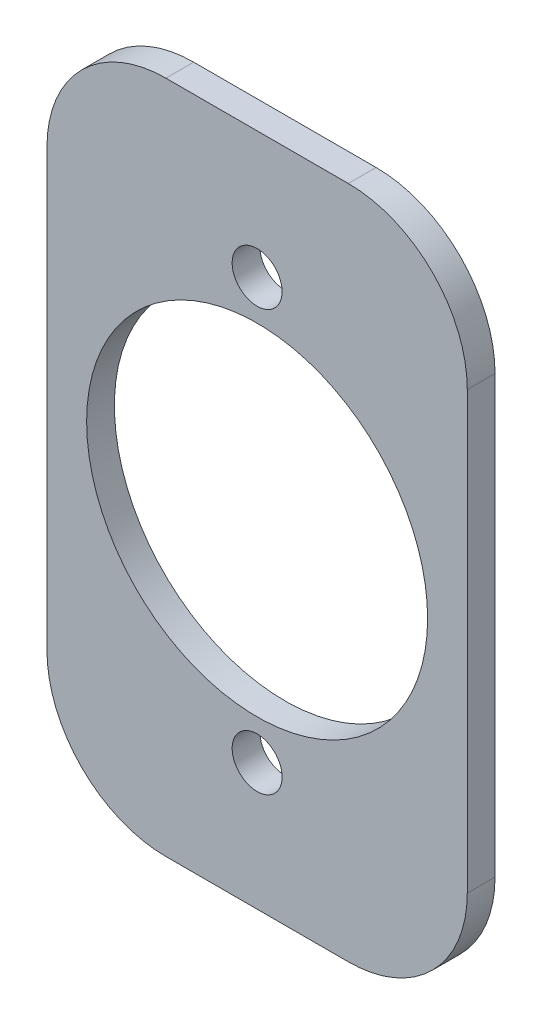
ISO-10303-21;
HEADER;
FILE_DESCRIPTION(('STEP AP214'),'2;1');
FILE_NAME('part.step','',(''),(''),'','','');
FILE_SCHEMA(('AUTOMOTIVE_DESIGN { 1 0 10303 214 1 1 1 1 }'));
ENDSEC;
DATA;
#1=APPLICATION_CONTEXT('core data for automotive mechanical design processes');
#2=APPLICATION_PROTOCOL_DEFINITION('international standard','automotive_design',2000,#1);
#3=PRODUCT_CONTEXT('',#1,'mechanical');
#4=PRODUCT('Part','Part','',(#3));
#5=PRODUCT_RELATED_PRODUCT_CATEGORY('part','',(#4));
#6=PRODUCT_DEFINITION_FORMATION('','',#4);
#7=PRODUCT_DEFINITION_CONTEXT('part definition',#1,'design');
#8=PRODUCT_DEFINITION('design','',#6,#7);
#9=PRODUCT_DEFINITION_SHAPE('','',#8);
#10=(LENGTH_UNIT() NAMED_UNIT(*) SI_UNIT(.MILLI.,.METRE.));
#11=(NAMED_UNIT(*) PLANE_ANGLE_UNIT() SI_UNIT($,.RADIAN.));
#12=(NAMED_UNIT(*) SI_UNIT($,.STERADIAN.) SOLID_ANGLE_UNIT());
#13=UNCERTAINTY_MEASURE_WITH_UNIT(LENGTH_MEASURE(1.E-05),#10,'distance_accuracy_value','');
#14=(GEOMETRIC_REPRESENTATION_CONTEXT(3) GLOBAL_UNCERTAINTY_ASSIGNED_CONTEXT((#13)) GLOBAL_UNIT_ASSIGNED_CONTEXT((#10,
#11,#12)) REPRESENTATION_CONTEXT('',''));
#15=CARTESIAN_POINT('',(0.,0.,0.));
#16=DIRECTION('',(0.,0.,1.));
#17=DIRECTION('',(1.,0.,0.));
#18=AXIS2_PLACEMENT_3D('',#15,#16,#17);
#19=CARTESIAN_POINT('',(-26.5,-42.5,-3.5));
#20=DIRECTION('',(1.,0.,0.));
#21=DIRECTION('',(0.,0.,-1.));
#22=AXIS2_PLACEMENT_3D('',#19,#20,#21);
#23=PLANE('',#22);
#24=DIRECTION('',(0.,0.,1.));
#25=VECTOR('',#24,1.);
#26=CARTESIAN_POINT('',(-26.5,-27.5,-3.5));
#27=LINE('',#26,#25);
#28=CARTESIAN_POINT('',(-26.5,-27.5,-3.5));
#29=VERTEX_POINT('',#28);
#30=CARTESIAN_POINT('',(-26.5,-27.5,0.));
#31=VERTEX_POINT('',#30);
#32=EDGE_CURVE('E143',#29,#31,#27,.T.);
#33=ORIENTED_EDGE('',*,*,#32,.T.);
#34=DIRECTION('',(0.,1.,0.));
#35=VECTOR('',#34,1.);
#36=CARTESIAN_POINT('',(-26.5,-42.5,0.));
#37=LINE('',#36,#35);
#38=CARTESIAN_POINT('',(-26.5,27.5,0.));
#39=VERTEX_POINT('',#38);
#40=EDGE_CURVE('E112',#31,#39,#37,.T.);
#41=ORIENTED_EDGE('',*,*,#40,.T.);
#42=DIRECTION('',(0.,0.,1.));
#43=VECTOR('',#42,1.);
#44=CARTESIAN_POINT('',(-26.5,27.5,-3.5));
#45=LINE('',#44,#43);
#46=CARTESIAN_POINT('',(-26.5,27.5,-3.5));
#47=VERTEX_POINT('',#46);
#48=EDGE_CURVE('E146',#39,#47,#45,.F.);
#49=ORIENTED_EDGE('',*,*,#48,.T.);
#50=DIRECTION('',(0.,1.,0.));
#51=VECTOR('',#50,1.);
#52=CARTESIAN_POINT('',(-26.5,-42.5,-3.5));
#53=LINE('',#52,#51);
#54=EDGE_CURVE('E155',#29,#47,#53,.T.);
#55=ORIENTED_EDGE('',*,*,#54,.F.);
#56=EDGE_LOOP('',(#33,#41,#49,#55));
#57=FACE_BOUND('',#56,.T.);
#58=ADVANCED_FACE('F39',(#57),#23,.F.);
#59=CARTESIAN_POINT('',(26.5,42.5,-3.5));
#60=DIRECTION('',(0.,-1.,0.));
#61=DIRECTION('',(0.,0.,-1.));
#62=AXIS2_PLACEMENT_3D('',#59,#60,#61);
#63=PLANE('',#62);
#64=DIRECTION('',(0.,0.,1.));
#65=VECTOR('',#64,1.);
#66=CARTESIAN_POINT('',(-11.5,42.5,-3.5));
#67=LINE('',#66,#65);
#68=CARTESIAN_POINT('',(-11.5,42.5,-3.5));
#69=VERTEX_POINT('',#68);
#70=CARTESIAN_POINT('',(-11.5,42.5,0.));
#71=VERTEX_POINT('',#70);
#72=EDGE_CURVE('E120',#69,#71,#67,.T.);
#73=ORIENTED_EDGE('',*,*,#72,.T.);
#74=DIRECTION('',(-1.,0.,0.));
#75=VECTOR('',#74,1.);
#76=CARTESIAN_POINT('',(-26.5,42.5,0.));
#77=LINE('',#76,#75);
#78=CARTESIAN_POINT('',(11.5,42.5,0.));
#79=VERTEX_POINT('',#78);
#80=EDGE_CURVE('E53',#79,#71,#77,.T.);
#81=ORIENTED_EDGE('',*,*,#80,.F.);
#82=DIRECTION('',(0.,0.,1.));
#83=VECTOR('',#82,1.);
#84=CARTESIAN_POINT('',(11.5,42.5,-3.5));
#85=LINE('',#84,#83);
#86=CARTESIAN_POINT('',(11.5,42.5,-3.5));
#87=VERTEX_POINT('',#86);
#88=EDGE_CURVE('E47',#79,#87,#85,.F.);
#89=ORIENTED_EDGE('',*,*,#88,.T.);
#90=DIRECTION('',(1.,0.,0.));
#91=VECTOR('',#90,1.);
#92=CARTESIAN_POINT('',(26.5,42.5,-3.5));
#93=LINE('',#92,#91);
#94=EDGE_CURVE('E153',#69,#87,#93,.T.);
#95=ORIENTED_EDGE('',*,*,#94,.F.);
#96=EDGE_LOOP('',(#73,#81,#89,#95));
#97=FACE_BOUND('',#96,.T.);
#98=ADVANCED_FACE('F116',(#97),#63,.F.);
#99=CARTESIAN_POINT('',(26.5,-42.5,-3.5));
#100=DIRECTION('',(-1.,0.,0.));
#101=DIRECTION('',(0.,0.,1.));
#102=AXIS2_PLACEMENT_3D('',#99,#100,#101);
#103=PLANE('',#102);
#104=DIRECTION('',(0.,0.,1.));
#105=VECTOR('',#104,1.);
#106=CARTESIAN_POINT('',(26.5,27.5,-3.5));
#107=LINE('',#106,#105);
#108=CARTESIAN_POINT('',(26.5,27.5,-3.5));
#109=VERTEX_POINT('',#108);
#110=CARTESIAN_POINT('',(26.5,27.5,0.));
#111=VERTEX_POINT('',#110);
#112=EDGE_CURVE('E129',#109,#111,#107,.T.);
#113=ORIENTED_EDGE('',*,*,#112,.T.);
#114=DIRECTION('',(0.,1.,0.));
#115=VECTOR('',#114,1.);
#116=CARTESIAN_POINT('',(26.5,-42.5,0.));
#117=LINE('',#116,#115);
#118=CARTESIAN_POINT('',(26.5,-27.5,0.));
#119=VERTEX_POINT('',#118);
#120=EDGE_CURVE('E106',#119,#111,#117,.T.);
#121=ORIENTED_EDGE('',*,*,#120,.F.);
#122=DIRECTION('',(0.,0.,1.));
#123=VECTOR('',#122,1.);
#124=CARTESIAN_POINT('',(26.5,-27.5,-3.5));
#125=LINE('',#124,#123);
#126=CARTESIAN_POINT('',(26.5,-27.5,-3.5));
#127=VERTEX_POINT('',#126);
#128=EDGE_CURVE('E61',#119,#127,#125,.F.);
#129=ORIENTED_EDGE('',*,*,#128,.T.);
#130=DIRECTION('',(0.,-1.,0.));
#131=VECTOR('',#130,1.);
#132=CARTESIAN_POINT('',(26.5,-42.5,-3.5));
#133=LINE('',#132,#131);
#134=EDGE_CURVE('E151',#109,#127,#133,.T.);
#135=ORIENTED_EDGE('',*,*,#134,.F.);
#136=EDGE_LOOP('',(#113,#121,#129,#135));
#137=FACE_BOUND('',#136,.T.);
#138=ADVANCED_FACE('F202',(#137),#103,.F.);
#139=CARTESIAN_POINT('',(26.5,-42.5,-3.5));
#140=DIRECTION('',(0.,1.,0.));
#141=DIRECTION('',(0.,0.,1.));
#142=AXIS2_PLACEMENT_3D('',#139,#140,#141);
#143=PLANE('',#142);
#144=DIRECTION('',(0.,0.,1.));
#145=VECTOR('',#144,1.);
#146=CARTESIAN_POINT('',(11.5,-42.5,-3.5));
#147=LINE('',#146,#145);
#148=CARTESIAN_POINT('',(11.5,-42.5,-3.5));
#149=VERTEX_POINT('',#148);
#150=CARTESIAN_POINT('',(11.5,-42.5,0.));
#151=VERTEX_POINT('',#150);
#152=EDGE_CURVE('E140',#149,#151,#147,.T.);
#153=ORIENTED_EDGE('',*,*,#152,.T.);
#154=DIRECTION('',(-1.,0.,0.));
#155=VECTOR('',#154,1.);
#156=CARTESIAN_POINT('',(-26.5,-42.5,0.));
#157=LINE('',#156,#155);
#158=CARTESIAN_POINT('',(-11.5,-42.5,0.));
#159=VERTEX_POINT('',#158);
#160=EDGE_CURVE('E121',#151,#159,#157,.T.);
#161=ORIENTED_EDGE('',*,*,#160,.T.);
#162=DIRECTION('',(0.,0.,1.));
#163=VECTOR('',#162,1.);
#164=CARTESIAN_POINT('',(-11.5,-42.5,-3.5));
#165=LINE('',#164,#163);
#166=CARTESIAN_POINT('',(-11.5,-42.5,-3.5));
#167=VERTEX_POINT('',#166);
#168=EDGE_CURVE('E138',#159,#167,#165,.F.);
#169=ORIENTED_EDGE('',*,*,#168,.T.);
#170=DIRECTION('',(-1.,0.,0.));
#171=VECTOR('',#170,1.);
#172=CARTESIAN_POINT('',(26.5,-42.5,-3.5));
#173=LINE('',#172,#171);
#174=EDGE_CURVE('E148',#149,#167,#173,.T.);
#175=ORIENTED_EDGE('',*,*,#174,.F.);
#176=EDGE_LOOP('',(#153,#161,#169,#175));
#177=FACE_BOUND('',#176,.T.);
#178=ADVANCED_FACE('F185',(#177),#143,.F.);
#179=CARTESIAN_POINT('',(0.,0.,-3.5));
#180=DIRECTION('',(0.,0.,1.));
#181=DIRECTION('',(1.,0.,0.));
#182=AXIS2_PLACEMENT_3D('',#179,#180,#181);
#183=PLANE('',#182);
#184=CARTESIAN_POINT('',(0.,26.5,-3.5));
#185=DIRECTION('',(0.,0.,1.));
#186=DIRECTION('',(1.,0.,0.));
#187=AXIS2_PLACEMENT_3D('',#184,#185,#186);
#188=CIRCLE('',#187,3.15);
#189=CARTESIAN_POINT('',(3.14999999999999,26.5,-3.5));
#190=VERTEX_POINT('',#189);
#191=EDGE_CURVE('E161',#190,#190,#188,.T.);
#192=ORIENTED_EDGE('',*,*,#191,.T.);
#193=EDGE_LOOP('',(#192));
#194=FACE_BOUND('',#193,.T.);
#195=CARTESIAN_POINT('',(0.,-26.5,-3.5));
#196=DIRECTION('',(0.,0.,1.));
#197=DIRECTION('',(1.,0.,0.));
#198=AXIS2_PLACEMENT_3D('',#195,#196,#197);
#199=CIRCLE('',#198,3.15);
#200=CARTESIAN_POINT('',(3.15000000000001,-26.5,-3.5));
#201=VERTEX_POINT('',#200);
#202=EDGE_CURVE('E162',#201,#201,#199,.T.);
#203=ORIENTED_EDGE('',*,*,#202,.T.);
#204=EDGE_LOOP('',(#203));
#205=FACE_BOUND('',#204,.T.);
#206=CARTESIAN_POINT('',(0.,0.,-3.5));
#207=DIRECTION('',(0.,0.,1.));
#208=DIRECTION('',(1.,0.,0.));
#209=AXIS2_PLACEMENT_3D('',#206,#207,#208);
#210=CIRCLE('',#209,21.5);
#211=CARTESIAN_POINT('',(21.5,0.,-3.5));
#212=VERTEX_POINT('',#211);
#213=EDGE_CURVE('E158',#212,#212,#210,.T.);
#214=ORIENTED_EDGE('',*,*,#213,.T.);
#215=EDGE_LOOP('',(#214));
#216=FACE_BOUND('',#215,.T.);
#217=ORIENTED_EDGE('',*,*,#174,.T.);
#218=CARTESIAN_POINT('',(-11.5,-27.5,-3.5));
#219=DIRECTION('',(0.,0.,1.));
#220=DIRECTION('',(1.,0.,0.));
#221=AXIS2_PLACEMENT_3D('',#218,#219,#220);
#222=CIRCLE('',#221,15.);
#223=EDGE_CURVE('E131',#167,#29,#222,.F.);
#224=ORIENTED_EDGE('',*,*,#223,.T.);
#225=ORIENTED_EDGE('',*,*,#54,.T.);
#226=CARTESIAN_POINT('',(-11.5,27.5,-3.5));
#227=DIRECTION('',(0.,0.,1.));
#228=DIRECTION('',(1.,0.,0.));
#229=AXIS2_PLACEMENT_3D('',#226,#227,#228);
#230=CIRCLE('',#229,15.);
#231=EDGE_CURVE('E136',#47,#69,#230,.F.);
#232=ORIENTED_EDGE('',*,*,#231,.T.);
#233=ORIENTED_EDGE('',*,*,#94,.T.);
#234=CARTESIAN_POINT('',(11.5,27.5,-3.5));
#235=DIRECTION('',(0.,0.,1.));
#236=DIRECTION('',(1.,0.,0.));
#237=AXIS2_PLACEMENT_3D('',#234,#235,#236);
#238=CIRCLE('',#237,15.);
#239=EDGE_CURVE('E125',#87,#109,#238,.F.);
#240=ORIENTED_EDGE('',*,*,#239,.T.);
#241=ORIENTED_EDGE('',*,*,#134,.T.);
#242=CARTESIAN_POINT('',(11.5,-27.5,-3.5));
#243=DIRECTION('',(0.,0.,1.));
#244=DIRECTION('',(1.,0.,0.));
#245=AXIS2_PLACEMENT_3D('',#242,#243,#244);
#246=CIRCLE('',#245,15.);
#247=EDGE_CURVE('E133',#127,#149,#246,.F.);
#248=ORIENTED_EDGE('',*,*,#247,.T.);
#249=EDGE_LOOP('',(#217,#224,#225,#232,#233,#240,#241,#248));
#250=FACE_BOUND('',#249,.T.);
#251=ADVANCED_FACE('F196',(#194,#205,#216,#250),#183,.F.);
#252=CARTESIAN_POINT('',(0.,0.,-3.5));
#253=DIRECTION('',(0.,0.,1.));
#254=DIRECTION('',(1.,0.,0.));
#255=AXIS2_PLACEMENT_3D('',#252,#253,#254);
#256=CYLINDRICAL_SURFACE('',#255,21.5);
#257=CARTESIAN_POINT('',(0.,0.,0.));
#258=DIRECTION('',(0.,0.,-1.));
#259=DIRECTION('',(-1.,0.,0.));
#260=AXIS2_PLACEMENT_3D('',#257,#258,#259);
#261=CIRCLE('',#260,21.5);
#262=CARTESIAN_POINT('',(-21.5,0.,0.));
#263=VERTEX_POINT('',#262);
#264=EDGE_CURVE('E165',#263,#263,#261,.F.);
#265=ORIENTED_EDGE('',*,*,#264,.T.);
#266=EDGE_LOOP('',(#265));
#267=FACE_BOUND('',#266,.T.);
#268=ORIENTED_EDGE('',*,*,#213,.F.);
#269=EDGE_LOOP('',(#268));
#270=FACE_BOUND('',#269,.T.);
#271=ADVANCED_FACE('F226',(#267,#270),#256,.F.);
#272=CARTESIAN_POINT('',(0.,-26.5,-3.5));
#273=DIRECTION('',(0.,0.,1.));
#274=DIRECTION('',(1.,0.,0.));
#275=AXIS2_PLACEMENT_3D('',#272,#273,#274);
#276=CYLINDRICAL_SURFACE('',#275,3.15);
#277=CARTESIAN_POINT('',(0.,-26.5,0.));
#278=DIRECTION('',(0.,0.,-1.));
#279=DIRECTION('',(-1.,0.,0.));
#280=AXIS2_PLACEMENT_3D('',#277,#278,#279);
#281=CIRCLE('',#280,3.15);
#282=CARTESIAN_POINT('',(-3.14999999999999,-26.5,0.));
#283=VERTEX_POINT('',#282);
#284=EDGE_CURVE('E170',#283,#283,#281,.F.);
#285=ORIENTED_EDGE('',*,*,#284,.T.);
#286=EDGE_LOOP('',(#285));
#287=FACE_BOUND('',#286,.T.);
#288=ORIENTED_EDGE('',*,*,#202,.F.);
#289=EDGE_LOOP('',(#288));
#290=FACE_BOUND('',#289,.T.);
#291=ADVANCED_FACE('F230',(#287,#290),#276,.F.);
#292=CARTESIAN_POINT('',(0.,26.5,-3.5));
#293=DIRECTION('',(0.,0.,1.));
#294=DIRECTION('',(1.,0.,0.));
#295=AXIS2_PLACEMENT_3D('',#292,#293,#294);
#296=CYLINDRICAL_SURFACE('',#295,3.15);
#297=CARTESIAN_POINT('',(0.,26.5,0.));
#298=DIRECTION('',(0.,0.,-1.));
#299=DIRECTION('',(-1.,0.,0.));
#300=AXIS2_PLACEMENT_3D('',#297,#298,#299);
#301=CIRCLE('',#300,3.15);
#302=CARTESIAN_POINT('',(-3.15000000000001,26.5,0.));
#303=VERTEX_POINT('',#302);
#304=EDGE_CURVE('E173',#303,#303,#301,.F.);
#305=ORIENTED_EDGE('',*,*,#304,.T.);
#306=EDGE_LOOP('',(#305));
#307=FACE_BOUND('',#306,.T.);
#308=ORIENTED_EDGE('',*,*,#191,.F.);
#309=EDGE_LOOP('',(#308));
#310=FACE_BOUND('',#309,.T.);
#311=ADVANCED_FACE('F211',(#307,#310),#296,.F.);
#312=CARTESIAN_POINT('',(-11.5,-27.5,-3.5));
#313=DIRECTION('',(0.,0.,1.));
#314=DIRECTION('',(1.,0.,0.));
#315=AXIS2_PLACEMENT_3D('',#312,#313,#314);
#316=CYLINDRICAL_SURFACE('',#315,15.);
#317=CARTESIAN_POINT('',(-11.5,-27.5,0.));
#318=DIRECTION('',(0.,0.,-1.));
#319=DIRECTION('',(-1.,0.,0.));
#320=AXIS2_PLACEMENT_3D('',#317,#318,#319);
#321=CIRCLE('',#320,15.);
#322=EDGE_CURVE('E176',#31,#159,#321,.F.);
#323=ORIENTED_EDGE('',*,*,#322,.F.);
#324=ORIENTED_EDGE('',*,*,#32,.F.);
#325=ORIENTED_EDGE('',*,*,#223,.F.);
#326=ORIENTED_EDGE('',*,*,#168,.F.);
#327=EDGE_LOOP('',(#323,#324,#325,#326));
#328=FACE_BOUND('',#327,.T.);
#329=ADVANCED_FACE('F192',(#328),#316,.T.);
#330=CARTESIAN_POINT('',(11.5,-27.5,-3.5));
#331=DIRECTION('',(0.,0.,1.));
#332=DIRECTION('',(1.,0.,0.));
#333=AXIS2_PLACEMENT_3D('',#330,#331,#332);
#334=CYLINDRICAL_SURFACE('',#333,15.);
#335=CARTESIAN_POINT('',(11.5,-27.5,0.));
#336=DIRECTION('',(0.,0.,-1.));
#337=DIRECTION('',(-1.,0.,0.));
#338=AXIS2_PLACEMENT_3D('',#335,#336,#337);
#339=CIRCLE('',#338,15.);
#340=EDGE_CURVE('E111',#151,#119,#339,.F.);
#341=ORIENTED_EDGE('',*,*,#340,.F.);
#342=ORIENTED_EDGE('',*,*,#152,.F.);
#343=ORIENTED_EDGE('',*,*,#247,.F.);
#344=ORIENTED_EDGE('',*,*,#128,.F.);
#345=EDGE_LOOP('',(#341,#342,#343,#344));
#346=FACE_BOUND('',#345,.T.);
#347=ADVANCED_FACE('F204',(#346),#334,.T.);
#348=CARTESIAN_POINT('',(11.5,27.5,-3.5));
#349=DIRECTION('',(0.,0.,1.));
#350=DIRECTION('',(1.,0.,0.));
#351=AXIS2_PLACEMENT_3D('',#348,#349,#350);
#352=CYLINDRICAL_SURFACE('',#351,15.);
#353=CARTESIAN_POINT('',(11.5,27.5,0.));
#354=DIRECTION('',(0.,0.,-1.));
#355=DIRECTION('',(-1.,0.,0.));
#356=AXIS2_PLACEMENT_3D('',#353,#354,#355);
#357=CIRCLE('',#356,15.);
#358=EDGE_CURVE('E103',#111,#79,#357,.F.);
#359=ORIENTED_EDGE('',*,*,#358,.F.);
#360=ORIENTED_EDGE('',*,*,#112,.F.);
#361=ORIENTED_EDGE('',*,*,#239,.F.);
#362=ORIENTED_EDGE('',*,*,#88,.F.);
#363=EDGE_LOOP('',(#359,#360,#361,#362));
#364=FACE_BOUND('',#363,.T.);
#365=ADVANCED_FACE('F124',(#364),#352,.T.);
#366=CARTESIAN_POINT('',(-11.5,27.5,-3.5));
#367=DIRECTION('',(0.,0.,1.));
#368=DIRECTION('',(1.,0.,0.));
#369=AXIS2_PLACEMENT_3D('',#366,#367,#368);
#370=CYLINDRICAL_SURFACE('',#369,15.);
#371=CARTESIAN_POINT('',(-11.5,27.5,0.));
#372=DIRECTION('',(0.,0.,-1.));
#373=DIRECTION('',(-1.,0.,0.));
#374=AXIS2_PLACEMENT_3D('',#371,#372,#373);
#375=CIRCLE('',#374,15.);
#376=EDGE_CURVE('E11',#71,#39,#375,.F.);
#377=ORIENTED_EDGE('',*,*,#376,.F.);
#378=ORIENTED_EDGE('',*,*,#72,.F.);
#379=ORIENTED_EDGE('',*,*,#231,.F.);
#380=ORIENTED_EDGE('',*,*,#48,.F.);
#381=EDGE_LOOP('',(#377,#378,#379,#380));
#382=FACE_BOUND('',#381,.T.);
#383=ADVANCED_FACE('F41',(#382),#370,.T.);
#384=CARTESIAN_POINT('',(-26.5,-42.5,0.));
#385=DIRECTION('',(0.,0.,-1.));
#386=DIRECTION('',(-1.,0.,0.));
#387=AXIS2_PLACEMENT_3D('',#384,#385,#386);
#388=PLANE('',#387);
#389=ORIENTED_EDGE('',*,*,#284,.F.);
#390=EDGE_LOOP('',(#389));
#391=FACE_BOUND('',#390,.T.);
#392=ORIENTED_EDGE('',*,*,#322,.T.);
#393=ORIENTED_EDGE('',*,*,#160,.F.);
#394=ORIENTED_EDGE('',*,*,#340,.T.);
#395=ORIENTED_EDGE('',*,*,#120,.T.);
#396=ORIENTED_EDGE('',*,*,#358,.T.);
#397=ORIENTED_EDGE('',*,*,#80,.T.);
#398=ORIENTED_EDGE('',*,*,#376,.T.);
#399=ORIENTED_EDGE('',*,*,#40,.F.);
#400=EDGE_LOOP('',(#392,#393,#394,#395,#396,#397,#398,#399));
#401=FACE_BOUND('',#400,.T.);
#402=ORIENTED_EDGE('',*,*,#304,.F.);
#403=EDGE_LOOP('',(#402));
#404=FACE_BOUND('',#403,.T.);
#405=ORIENTED_EDGE('',*,*,#264,.F.);
#406=EDGE_LOOP('',(#405));
#407=FACE_BOUND('',#406,.T.);
#408=ADVANCED_FACE('F104',(#391,#401,#404,#407),#388,.F.);
#409=CLOSED_SHELL('',(#58,#98,#138,#178,#251,#271,#291,#311,#329,#347,#365,#383,#408));
#410=MANIFOLD_SOLID_BREP('B2',#409);
#411=ADVANCED_BREP_SHAPE_REPRESENTATION('',(#18,#410),#14);
#412=SHAPE_DEFINITION_REPRESENTATION(#9,#411);
ENDSEC;
END-ISO-10303-21;
